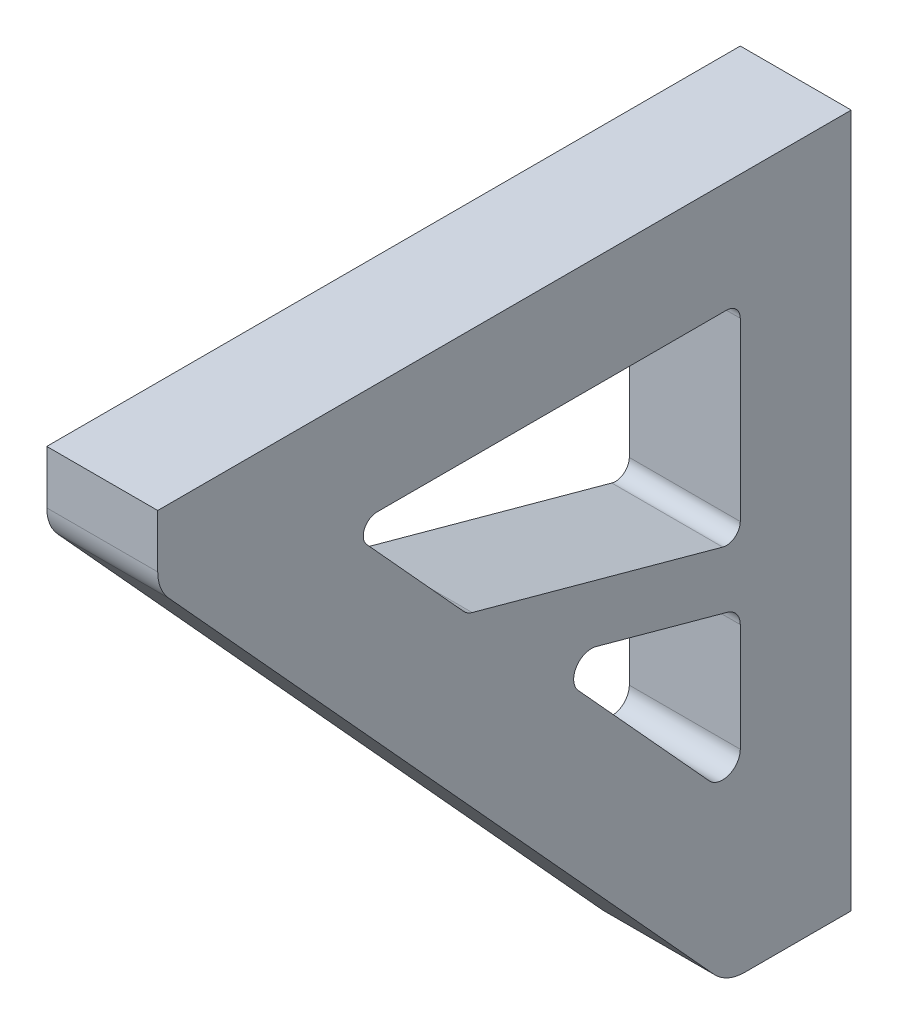
ISO-10303-21;
HEADER;
FILE_DESCRIPTION(('STEP AP214'),'2;1');
FILE_NAME('part.step','',(''),(''),'','','');
FILE_SCHEMA(('AUTOMOTIVE_DESIGN { 1 0 10303 214 1 1 1 1 }'));
ENDSEC;
DATA;
#1=APPLICATION_CONTEXT('core data for automotive mechanical design processes');
#2=APPLICATION_PROTOCOL_DEFINITION('international standard','automotive_design',2000,#1);
#3=PRODUCT_CONTEXT('',#1,'mechanical');
#4=PRODUCT('Part','Part','',(#3));
#5=PRODUCT_RELATED_PRODUCT_CATEGORY('part','',(#4));
#6=PRODUCT_DEFINITION_FORMATION('','',#4);
#7=PRODUCT_DEFINITION_CONTEXT('part definition',#1,'design');
#8=PRODUCT_DEFINITION('design','',#6,#7);
#9=PRODUCT_DEFINITION_SHAPE('','',#8);
#10=(LENGTH_UNIT() NAMED_UNIT(*) SI_UNIT(.MILLI.,.METRE.));
#11=(NAMED_UNIT(*) PLANE_ANGLE_UNIT() SI_UNIT($,.RADIAN.));
#12=(NAMED_UNIT(*) SI_UNIT($,.STERADIAN.) SOLID_ANGLE_UNIT());
#13=UNCERTAINTY_MEASURE_WITH_UNIT(LENGTH_MEASURE(1.E-05),#10,'distance_accuracy_value','');
#14=(GEOMETRIC_REPRESENTATION_CONTEXT(3) GLOBAL_UNCERTAINTY_ASSIGNED_CONTEXT((#13)) GLOBAL_UNIT_ASSIGNED_CONTEXT((#10,
#11,#12)) REPRESENTATION_CONTEXT('',''));
#15=CARTESIAN_POINT('',(0.,0.,0.));
#16=DIRECTION('',(0.,0.,1.));
#17=DIRECTION('',(1.,0.,0.));
#18=AXIS2_PLACEMENT_3D('',#15,#16,#17);
#19=CARTESIAN_POINT('',(8.,0.,50.));
#20=DIRECTION('',(0.,1.,0.));
#21=DIRECTION('',(0.,0.,1.));
#22=AXIS2_PLACEMENT_3D('',#19,#20,#21);
#23=PLANE('',#22);
#24=DIRECTION('',(0.,0.,-1.));
#25=VECTOR('',#24,1.);
#26=CARTESIAN_POINT('',(8.,0.,50.));
#27=LINE('',#26,#25);
#28=CARTESIAN_POINT('',(8.,0.,7.67487166527349));
#29=VERTEX_POINT('',#28);
#30=CARTESIAN_POINT('',(8.,0.,0.));
#31=VERTEX_POINT('',#30);
#32=EDGE_CURVE('E310',#29,#31,#27,.T.);
#33=ORIENTED_EDGE('',*,*,#32,.F.);
#34=DIRECTION('',(-1.,0.,0.));
#35=VECTOR('',#34,1.);
#36=CARTESIAN_POINT('',(8.,0.,7.67487166527349));
#37=LINE('',#36,#35);
#38=CARTESIAN_POINT('',(0.,0.,7.67487166527349));
#39=VERTEX_POINT('',#38);
#40=EDGE_CURVE('E312',#29,#39,#37,.T.);
#41=ORIENTED_EDGE('',*,*,#40,.T.);
#42=DIRECTION('',(0.,0.,-1.));
#43=VECTOR('',#42,1.);
#44=CARTESIAN_POINT('',(0.,0.,50.));
#45=LINE('',#44,#43);
#46=CARTESIAN_POINT('',(0.,0.,0.));
#47=VERTEX_POINT('',#46);
#48=EDGE_CURVE('E294',#39,#47,#45,.T.);
#49=ORIENTED_EDGE('',*,*,#48,.T.);
#50=DIRECTION('',(1.,0.,0.));
#51=VECTOR('',#50,1.);
#52=CARTESIAN_POINT('',(8.,0.,0.));
#53=LINE('',#52,#51);
#54=EDGE_CURVE('E285',#47,#31,#53,.T.);
#55=ORIENTED_EDGE('',*,*,#54,.T.);
#56=EDGE_LOOP('',(#33,#41,#49,#55));
#57=FACE_BOUND('',#56,.T.);
#58=ADVANCED_FACE('F37',(#57),#23,.F.);
#59=CARTESIAN_POINT('',(8.,50.,50.));
#60=DIRECTION('',(-1.,0.,0.));
#61=DIRECTION('',(0.,0.,1.));
#62=AXIS2_PLACEMENT_3D('',#59,#60,#61);
#63=PLANE('',#62);
#64=DIRECTION('',(0.,-1.,0.));
#65=VECTOR('',#64,1.);
#66=CARTESIAN_POINT('',(8.,14.0913484885808,8.));
#67=LINE('',#66,#65);
#68=CARTESIAN_POINT('',(8.,21.8746360039782,8.));
#69=VERTEX_POINT('',#68);
#70=CARTESIAN_POINT('',(8.,14.0913484885808,8.));
#71=VERTEX_POINT('',#70);
#72=EDGE_CURVE('E241',#69,#71,#67,.T.);
#73=ORIENTED_EDGE('',*,*,#72,.T.);
#74=CARTESIAN_POINT('',(8.,14.0913484885807,9.28195910334418));
#75=DIRECTION('',(-1.,0.,0.));
#76=DIRECTION('',(0.,0.,-1.));
#77=AXIS2_PLACEMENT_3D('',#74,#75,#76);
#78=CIRCLE('',#77,1.28195910334418);
#79=CARTESIAN_POINT('',(8.,13.2279618569618,10.2295785770723));
#80=VERTEX_POINT('',#79);
#81=EDGE_CURVE('E256',#71,#80,#78,.T.);
#82=ORIENTED_EDGE('',*,*,#81,.T.);
#83=DIRECTION('',(0.,0.739196337274797,0.673489996183703));
#84=VECTOR('',#83,1.);
#85=CARTESIAN_POINT('',(8.,23.5980334109107,19.6778659928924));
#86=LINE('',#85,#84);
#87=CARTESIAN_POINT('',(8.,23.5980334109107,19.6778659928924));
#88=VERTEX_POINT('',#87);
#89=EDGE_CURVE('E280',#80,#88,#86,.T.);
#90=ORIENTED_EDGE('',*,*,#89,.T.);
#91=CARTESIAN_POINT('',(8.,24.4614200425297,18.7302465191643));
#92=DIRECTION('',(-1.,0.,0.));
#93=DIRECTION('',(0.,0.,1.));
#94=AXIS2_PLACEMENT_3D('',#91,#92,#93);
#95=CIRCLE('',#94,1.28195910334418);
#96=CARTESIAN_POINT('',(8.,25.6978757294878,18.3917255052878));
#97=VERTEX_POINT('',#96);
#98=EDGE_CURVE('E277',#88,#97,#95,.T.);
#99=ORIENTED_EDGE('',*,*,#98,.T.);
#100=DIRECTION('',(0.,-0.264065376963551,-0.96450478313438));
#101=VECTOR('',#100,1.);
#102=CARTESIAN_POINT('',(8.,23.1110916909364,8.94343808946775));
#103=LINE('',#102,#101);
#104=CARTESIAN_POINT('',(8.,23.1110916909364,8.94343808946775));
#105=VERTEX_POINT('',#104);
#106=EDGE_CURVE('E274',#97,#105,#103,.T.);
#107=ORIENTED_EDGE('',*,*,#106,.T.);
#108=CARTESIAN_POINT('',(8.,21.8746360039782,9.28195910334418));
#109=DIRECTION('',(-1.,0.,0.));
#110=DIRECTION('',(0.,0.,1.));
#111=AXIS2_PLACEMENT_3D('',#108,#109,#110);
#112=CIRCLE('',#111,1.28195910334418);
#113=EDGE_CURVE('E271',#105,#69,#112,.T.);
#114=ORIENTED_EDGE('',*,*,#113,.T.);
#115=EDGE_LOOP('',(#73,#82,#90,#99,#107,#114));
#116=FACE_BOUND('',#115,.T.);
#117=DIRECTION('',(0.,-1.,0.));
#118=VECTOR('',#117,1.);
#119=CARTESIAN_POINT('',(8.,28.3105848711872,8.));
#120=LINE('',#119,#118);
#121=CARTESIAN_POINT('',(8.,41.,8.));
#122=VERTEX_POINT('',#121);
#123=CARTESIAN_POINT('',(8.,28.3105848711872,8.));
#124=VERTEX_POINT('',#123);
#125=EDGE_CURVE('E216',#122,#124,#120,.T.);
#126=ORIENTED_EDGE('',*,*,#125,.T.);
#127=CARTESIAN_POINT('',(8.,28.3105848711871,9.));
#128=DIRECTION('',(-1.,0.,0.));
#129=DIRECTION('',(0.,0.,-1.));
#130=AXIS2_PLACEMENT_3D('',#127,#128,#129);
#131=CIRCLE('',#130,1.);
#132=CARTESIAN_POINT('',(8.,27.3460800880528,9.26406537696356));
#133=VERTEX_POINT('',#132);
#134=EDGE_CURVE('E187',#124,#133,#131,.T.);
#135=ORIENTED_EDGE('',*,*,#134,.T.);
#136=DIRECTION('',(0.,0.264065376963552,0.96450478313438));
#137=VECTOR('',#136,1.);
#138=CARTESIAN_POINT('',(8.,32.2922532765692,27.3300752166164));
#139=LINE('',#138,#137);
#140=CARTESIAN_POINT('',(8.,32.2922532765692,27.3300752166164));
#141=VERTEX_POINT('',#140);
#142=EDGE_CURVE('E234',#133,#141,#139,.T.);
#143=ORIENTED_EDGE('',*,*,#142,.T.);
#144=CARTESIAN_POINT('',(8.,33.5287089635274,26.99155420274));
#145=DIRECTION('',(-1.,0.,0.));
#146=DIRECTION('',(0.,0.,-1.));
#147=AXIS2_PLACEMENT_3D('',#144,#145,#146);
#148=CIRCLE('',#147,1.28195910334418);
#149=CARTESIAN_POINT('',(8.,32.6653223319084,27.9391736764681));
#150=VERTEX_POINT('',#149);
#151=EDGE_CURVE('E231',#141,#150,#148,.T.);
#152=ORIENTED_EDGE('',*,*,#151,.T.);
#153=DIRECTION('',(0.,0.739196337274797,0.673489996183703));
#154=VECTOR('',#153,1.);
#155=CARTESIAN_POINT('',(8.,40.3265100038163,34.9193668886508));
#156=LINE('',#155,#154);
#157=CARTESIAN_POINT('',(8.,40.3265100038163,34.9193668886508));
#158=VERTEX_POINT('',#157);
#159=EDGE_CURVE('E228',#150,#158,#156,.T.);
#160=ORIENTED_EDGE('',*,*,#159,.T.);
#161=CARTESIAN_POINT('',(8.,41.,34.180170551376));
#162=DIRECTION('',(-1.,0.,0.));
#163=DIRECTION('',(0.,0.,1.));
#164=AXIS2_PLACEMENT_3D('',#161,#162,#163);
#165=CIRCLE('',#164,1.);
#166=CARTESIAN_POINT('',(8.,42.,34.180170551376));
#167=VERTEX_POINT('',#166);
#168=EDGE_CURVE('E225',#158,#167,#165,.T.);
#169=ORIENTED_EDGE('',*,*,#168,.T.);
#170=DIRECTION('',(0.,0.,-1.));
#171=VECTOR('',#170,1.);
#172=CARTESIAN_POINT('',(8.,42.,9.00000000000001));
#173=LINE('',#172,#171);
#174=CARTESIAN_POINT('',(8.,42.,9.00000000000001));
#175=VERTEX_POINT('',#174);
#176=EDGE_CURVE('E222',#167,#175,#173,.T.);
#177=ORIENTED_EDGE('',*,*,#176,.T.);
#178=CARTESIAN_POINT('',(8.,41.,9.));
#179=DIRECTION('',(-1.,0.,0.));
#180=DIRECTION('',(0.,0.,-1.));
#181=AXIS2_PLACEMENT_3D('',#178,#179,#180);
#182=CIRCLE('',#181,1.);
#183=EDGE_CURVE('E218',#175,#122,#182,.T.);
#184=ORIENTED_EDGE('',*,*,#183,.T.);
#185=EDGE_LOOP('',(#126,#135,#143,#152,#160,#169,#177,#184));
#186=FACE_BOUND('',#185,.T.);
#187=DIRECTION('',(0.,-0.739196337274797,-0.673489996183704));
#188=VECTOR('',#187,1.);
#189=CARTESIAN_POINT('',(8.,0.,9.));
#190=LINE('',#189,#188);
#191=CARTESIAN_POINT('',(8.,44.1412562324902,49.2175890118244));
#192=VERTEX_POINT('',#191);
#193=CARTESIAN_POINT('',(8.,0.979530011448891,9.89246067709788));
#194=VERTEX_POINT('',#193);
#195=EDGE_CURVE('E210',#192,#194,#190,.T.);
#196=ORIENTED_EDGE('',*,*,#195,.T.);
#197=CARTESIAN_POINT('',(8.,3.,7.67487166527349));
#198=DIRECTION('',(-1.,0.,0.));
#199=DIRECTION('',(0.,0.,1.));
#200=AXIS2_PLACEMENT_3D('',#197,#198,#199);
#201=CIRCLE('',#200,3.);
#202=EDGE_CURVE('E45',#194,#29,#201,.F.);
#203=ORIENTED_EDGE('',*,*,#202,.T.);
#204=ORIENTED_EDGE('',*,*,#32,.T.);
#205=DIRECTION('',(0.,1.,0.));
#206=VECTOR('',#205,1.);
#207=CARTESIAN_POINT('',(8.,50.,0.));
#208=LINE('',#207,#206);
#209=CARTESIAN_POINT('',(8.,50.,0.));
#210=VERTEX_POINT('',#209);
#211=EDGE_CURVE('E297',#31,#210,#208,.T.);
#212=ORIENTED_EDGE('',*,*,#211,.T.);
#213=DIRECTION('',(0.,0.,-1.));
#214=VECTOR('',#213,1.);
#215=CARTESIAN_POINT('',(8.,50.,50.));
#216=LINE('',#215,#214);
#217=CARTESIAN_POINT('',(8.,50.,50.));
#218=VERTEX_POINT('',#217);
#219=EDGE_CURVE('E307',#218,#210,#216,.T.);
#220=ORIENTED_EDGE('',*,*,#219,.F.);
#221=DIRECTION('',(0.,1.,0.));
#222=VECTOR('',#221,1.);
#223=CARTESIAN_POINT('',(8.,50.,50.));
#224=LINE('',#223,#222);
#225=CARTESIAN_POINT('',(8.,46.1617262210413,50.));
#226=VERTEX_POINT('',#225);
#227=EDGE_CURVE('E287',#226,#218,#224,.T.);
#228=ORIENTED_EDGE('',*,*,#227,.F.);
#229=CARTESIAN_POINT('',(8.,46.1617262210413,47.));
#230=DIRECTION('',(-1.,0.,0.));
#231=DIRECTION('',(0.,0.,1.));
#232=AXIS2_PLACEMENT_3D('',#229,#230,#231);
#233=CIRCLE('',#232,3.);
#234=EDGE_CURVE('E323',#226,#192,#233,.F.);
#235=ORIENTED_EDGE('',*,*,#234,.T.);
#236=EDGE_LOOP('',(#196,#203,#204,#212,#220,#228,#235));
#237=FACE_BOUND('',#236,.T.);
#238=ADVANCED_FACE('F327',(#116,#186,#237),#63,.F.);
#239=CARTESIAN_POINT('',(0.,50.,50.));
#240=DIRECTION('',(0.,-1.,0.));
#241=DIRECTION('',(0.,0.,-1.));
#242=AXIS2_PLACEMENT_3D('',#239,#240,#241);
#243=PLANE('',#242);
#244=DIRECTION('',(-1.,0.,0.));
#245=VECTOR('',#244,1.);
#246=CARTESIAN_POINT('',(0.,50.,0.));
#247=LINE('',#246,#245);
#248=CARTESIAN_POINT('',(0.,50.,0.));
#249=VERTEX_POINT('',#248);
#250=EDGE_CURVE('E299',#210,#249,#247,.T.);
#251=ORIENTED_EDGE('',*,*,#250,.T.);
#252=DIRECTION('',(0.,0.,-1.));
#253=VECTOR('',#252,1.);
#254=CARTESIAN_POINT('',(0.,50.,50.));
#255=LINE('',#254,#253);
#256=CARTESIAN_POINT('',(0.,50.,50.));
#257=VERTEX_POINT('',#256);
#258=EDGE_CURVE('E304',#257,#249,#255,.T.);
#259=ORIENTED_EDGE('',*,*,#258,.F.);
#260=DIRECTION('',(-1.,0.,0.));
#261=VECTOR('',#260,1.);
#262=CARTESIAN_POINT('',(0.,50.,50.));
#263=LINE('',#262,#261);
#264=EDGE_CURVE('E289',#218,#257,#263,.T.);
#265=ORIENTED_EDGE('',*,*,#264,.F.);
#266=ORIENTED_EDGE('',*,*,#219,.T.);
#267=EDGE_LOOP('',(#251,#259,#265,#266));
#268=FACE_BOUND('',#267,.T.);
#269=ADVANCED_FACE('F346',(#268),#243,.F.);
#270=CARTESIAN_POINT('',(0.,0.,50.));
#271=DIRECTION('',(1.,0.,0.));
#272=DIRECTION('',(0.,0.,-1.));
#273=AXIS2_PLACEMENT_3D('',#270,#271,#272);
#274=PLANE('',#273);
#275=DIRECTION('',(0.,0.739196337274797,0.673489996183703));
#276=VECTOR('',#275,1.);
#277=CARTESIAN_POINT('',(0.,23.5980334109107,19.6778659928924));
#278=LINE('',#277,#276);
#279=CARTESIAN_POINT('',(0.,13.2279618569618,10.2295785770723));
#280=VERTEX_POINT('',#279);
#281=CARTESIAN_POINT('',(0.,23.5980334109107,19.6778659928924));
#282=VERTEX_POINT('',#281);
#283=EDGE_CURVE('E265',#280,#282,#278,.T.);
#284=ORIENTED_EDGE('',*,*,#283,.F.);
#285=CARTESIAN_POINT('',(0.,14.0913484885807,9.28195910334418));
#286=DIRECTION('',(-1.,0.,0.));
#287=DIRECTION('',(0.,0.,-1.));
#288=AXIS2_PLACEMENT_3D('',#285,#286,#287);
#289=CIRCLE('',#288,1.28195910334418);
#290=CARTESIAN_POINT('',(0.,14.0913484885808,8.));
#291=VERTEX_POINT('',#290);
#292=EDGE_CURVE('E192',#291,#280,#289,.T.);
#293=ORIENTED_EDGE('',*,*,#292,.F.);
#294=DIRECTION('',(0.,-1.,0.));
#295=VECTOR('',#294,1.);
#296=CARTESIAN_POINT('',(0.,14.0913484885808,8.));
#297=LINE('',#296,#295);
#298=CARTESIAN_POINT('',(0.,21.8746360039782,8.));
#299=VERTEX_POINT('',#298);
#300=EDGE_CURVE('E252',#299,#291,#297,.T.);
#301=ORIENTED_EDGE('',*,*,#300,.F.);
#302=CARTESIAN_POINT('',(0.,21.8746360039782,9.28195910334418));
#303=DIRECTION('',(-1.,0.,0.));
#304=DIRECTION('',(0.,0.,1.));
#305=AXIS2_PLACEMENT_3D('',#302,#303,#304);
#306=CIRCLE('',#305,1.28195910334418);
#307=CARTESIAN_POINT('',(0.,23.1110916909364,8.94343808946775));
#308=VERTEX_POINT('',#307);
#309=EDGE_CURVE('E255',#308,#299,#306,.T.);
#310=ORIENTED_EDGE('',*,*,#309,.F.);
#311=DIRECTION('',(0.,-0.264065376963551,-0.96450478313438));
#312=VECTOR('',#311,1.);
#313=CARTESIAN_POINT('',(0.,23.1110916909364,8.94343808946775));
#314=LINE('',#313,#312);
#315=CARTESIAN_POINT('',(0.,25.6978757294878,18.3917255052878));
#316=VERTEX_POINT('',#315);
#317=EDGE_CURVE('E259',#316,#308,#314,.T.);
#318=ORIENTED_EDGE('',*,*,#317,.F.);
#319=CARTESIAN_POINT('',(0.,24.4614200425297,18.7302465191643));
#320=DIRECTION('',(-1.,0.,0.));
#321=DIRECTION('',(0.,0.,1.));
#322=AXIS2_PLACEMENT_3D('',#319,#320,#321);
#323=CIRCLE('',#322,1.28195910334418);
#324=EDGE_CURVE('E262',#282,#316,#323,.T.);
#325=ORIENTED_EDGE('',*,*,#324,.F.);
#326=EDGE_LOOP('',(#284,#293,#301,#310,#318,#325));
#327=FACE_BOUND('',#326,.T.);
#328=DIRECTION('',(0.,0.264065376963552,0.96450478313438));
#329=VECTOR('',#328,1.);
#330=CARTESIAN_POINT('',(0.,32.2922532765692,27.3300752166164));
#331=LINE('',#330,#329);
#332=CARTESIAN_POINT('',(0.,27.3460800880528,9.26406537696356));
#333=VERTEX_POINT('',#332);
#334=CARTESIAN_POINT('',(0.,32.2922532765692,27.3300752166164));
#335=VERTEX_POINT('',#334);
#336=EDGE_CURVE('E207',#333,#335,#331,.T.);
#337=ORIENTED_EDGE('',*,*,#336,.F.);
#338=CARTESIAN_POINT('',(0.,28.3105848711871,9.));
#339=DIRECTION('',(-1.,0.,0.));
#340=DIRECTION('',(0.,0.,-1.));
#341=AXIS2_PLACEMENT_3D('',#338,#339,#340);
#342=CIRCLE('',#341,1.);
#343=CARTESIAN_POINT('',(0.,28.3105848711872,8.));
#344=VERTEX_POINT('',#343);
#345=EDGE_CURVE('E184',#344,#333,#342,.T.);
#346=ORIENTED_EDGE('',*,*,#345,.F.);
#347=DIRECTION('',(0.,-1.,0.));
#348=VECTOR('',#347,1.);
#349=CARTESIAN_POINT('',(0.,28.3105848711872,8.));
#350=LINE('',#349,#348);
#351=CARTESIAN_POINT('',(0.,41.,8.));
#352=VERTEX_POINT('',#351);
#353=EDGE_CURVE('E195',#352,#344,#350,.T.);
#354=ORIENTED_EDGE('',*,*,#353,.F.);
#355=CARTESIAN_POINT('',(0.,41.,9.));
#356=DIRECTION('',(-1.,0.,0.));
#357=DIRECTION('',(0.,0.,-1.));
#358=AXIS2_PLACEMENT_3D('',#355,#356,#357);
#359=CIRCLE('',#358,1.);
#360=CARTESIAN_POINT('',(0.,42.,9.00000000000001));
#361=VERTEX_POINT('',#360);
#362=EDGE_CURVE('E200',#361,#352,#359,.T.);
#363=ORIENTED_EDGE('',*,*,#362,.F.);
#364=DIRECTION('',(0.,0.,-1.));
#365=VECTOR('',#364,1.);
#366=CARTESIAN_POINT('',(0.,42.,9.00000000000001));
#367=LINE('',#366,#365);
#368=CARTESIAN_POINT('',(0.,42.,34.180170551376));
#369=VERTEX_POINT('',#368);
#370=EDGE_CURVE('E428',#369,#361,#367,.T.);
#371=ORIENTED_EDGE('',*,*,#370,.F.);
#372=CARTESIAN_POINT('',(0.,41.,34.180170551376));
#373=DIRECTION('',(-1.,0.,0.));
#374=DIRECTION('',(0.,0.,1.));
#375=AXIS2_PLACEMENT_3D('',#372,#373,#374);
#376=CIRCLE('',#375,1.);
#377=CARTESIAN_POINT('',(0.,40.3265100038163,34.9193668886508));
#378=VERTEX_POINT('',#377);
#379=EDGE_CURVE('E430',#378,#369,#376,.T.);
#380=ORIENTED_EDGE('',*,*,#379,.F.);
#381=DIRECTION('',(0.,0.739196337274797,0.673489996183703));
#382=VECTOR('',#381,1.);
#383=CARTESIAN_POINT('',(0.,40.3265100038163,34.9193668886508));
#384=LINE('',#383,#382);
#385=CARTESIAN_POINT('',(0.,32.6653223319084,27.9391736764681));
#386=VERTEX_POINT('',#385);
#387=EDGE_CURVE('E433',#386,#378,#384,.T.);
#388=ORIENTED_EDGE('',*,*,#387,.F.);
#389=CARTESIAN_POINT('',(0.,33.5287089635274,26.99155420274));
#390=DIRECTION('',(-1.,0.,0.));
#391=DIRECTION('',(0.,0.,-1.));
#392=AXIS2_PLACEMENT_3D('',#389,#390,#391);
#393=CIRCLE('',#392,1.28195910334418);
#394=EDGE_CURVE('E212',#335,#386,#393,.T.);
#395=ORIENTED_EDGE('',*,*,#394,.F.);
#396=EDGE_LOOP('',(#337,#346,#354,#363,#371,#380,#388,#395));
#397=FACE_BOUND('',#396,.T.);
#398=ORIENTED_EDGE('',*,*,#48,.F.);
#399=CARTESIAN_POINT('',(0.,3.,7.67487166527349));
#400=DIRECTION('',(1.,0.,0.));
#401=DIRECTION('',(0.,0.,-1.));
#402=AXIS2_PLACEMENT_3D('',#399,#400,#401);
#403=CIRCLE('',#402,3.);
#404=CARTESIAN_POINT('',(0.,0.979530011448891,9.89246067709788));
#405=VERTEX_POINT('',#404);
#406=EDGE_CURVE('E317',#39,#405,#403,.F.);
#407=ORIENTED_EDGE('',*,*,#406,.T.);
#408=DIRECTION('',(0.,-0.739196337274797,-0.673489996183704));
#409=VECTOR('',#408,1.);
#410=CARTESIAN_POINT('',(0.,0.,9.));
#411=LINE('',#410,#409);
#412=CARTESIAN_POINT('',(0.,44.1412562324902,49.2175890118244));
#413=VERTEX_POINT('',#412);
#414=EDGE_CURVE('E208',#413,#405,#411,.T.);
#415=ORIENTED_EDGE('',*,*,#414,.F.);
#416=CARTESIAN_POINT('',(0.,46.1617262210413,47.));
#417=DIRECTION('',(1.,0.,0.));
#418=DIRECTION('',(0.,0.,-1.));
#419=AXIS2_PLACEMENT_3D('',#416,#417,#418);
#420=CIRCLE('',#419,3.);
#421=CARTESIAN_POINT('',(0.,46.1617262210413,50.));
#422=VERTEX_POINT('',#421);
#423=EDGE_CURVE('E315',#413,#422,#420,.F.);
#424=ORIENTED_EDGE('',*,*,#423,.T.);
#425=DIRECTION('',(0.,-1.,0.));
#426=VECTOR('',#425,1.);
#427=CARTESIAN_POINT('',(0.,0.,50.));
#428=LINE('',#427,#426);
#429=EDGE_CURVE('E292',#257,#422,#428,.T.);
#430=ORIENTED_EDGE('',*,*,#429,.F.);
#431=ORIENTED_EDGE('',*,*,#258,.T.);
#432=DIRECTION('',(0.,-1.,0.));
#433=VECTOR('',#432,1.);
#434=CARTESIAN_POINT('',(0.,0.,0.));
#435=LINE('',#434,#433);
#436=EDGE_CURVE('E290',#249,#47,#435,.T.);
#437=ORIENTED_EDGE('',*,*,#436,.T.);
#438=EDGE_LOOP('',(#398,#407,#415,#424,#430,#431,#437));
#439=FACE_BOUND('',#438,.T.);
#440=ADVANCED_FACE('F203',(#327,#397,#439),#274,.F.);
#441=CARTESIAN_POINT('',(0.,0.,50.));
#442=DIRECTION('',(0.,0.,-1.));
#443=DIRECTION('',(-1.,0.,0.));
#444=AXIS2_PLACEMENT_3D('',#441,#442,#443);
#445=PLANE('',#444);
#446=ORIENTED_EDGE('',*,*,#429,.T.);
#447=DIRECTION('',(-1.,0.,0.));
#448=VECTOR('',#447,1.);
#449=CARTESIAN_POINT('',(0.,46.1617262210413,50.));
#450=LINE('',#449,#448);
#451=EDGE_CURVE('E11',#422,#226,#450,.F.);
#452=ORIENTED_EDGE('',*,*,#451,.T.);
#453=ORIENTED_EDGE('',*,*,#227,.T.);
#454=ORIENTED_EDGE('',*,*,#264,.T.);
#455=EDGE_LOOP('',(#446,#452,#453,#454));
#456=FACE_BOUND('',#455,.T.);
#457=ADVANCED_FACE('F341',(#456),#445,.F.);
#458=CARTESIAN_POINT('',(0.,0.,0.));
#459=DIRECTION('',(0.,0.,-1.));
#460=DIRECTION('',(-1.,0.,0.));
#461=AXIS2_PLACEMENT_3D('',#458,#459,#460);
#462=PLANE('',#461);
#463=ORIENTED_EDGE('',*,*,#54,.F.);
#464=ORIENTED_EDGE('',*,*,#436,.F.);
#465=ORIENTED_EDGE('',*,*,#250,.F.);
#466=ORIENTED_EDGE('',*,*,#211,.F.);
#467=EDGE_LOOP('',(#463,#464,#465,#466));
#468=FACE_BOUND('',#467,.T.);
#469=ADVANCED_FACE('F350',(#468),#462,.T.);
#470=CARTESIAN_POINT('',(8.,0.,9.));
#471=DIRECTION('',(0.,0.673489996183704,-0.739196337274797));
#472=DIRECTION('',(0.,0.739196337274797,0.673489996183704));
#473=AXIS2_PLACEMENT_3D('',#470,#471,#472);
#474=PLANE('',#473);
#475=ORIENTED_EDGE('',*,*,#414,.T.);
#476=DIRECTION('',(-1.,0.,0.));
#477=VECTOR('',#476,1.);
#478=CARTESIAN_POINT('',(8.,0.979530011448891,9.89246067709788));
#479=LINE('',#478,#477);
#480=EDGE_CURVE('E58',#405,#194,#479,.F.);
#481=ORIENTED_EDGE('',*,*,#480,.T.);
#482=ORIENTED_EDGE('',*,*,#195,.F.);
#483=DIRECTION('',(-1.,0.,0.));
#484=VECTOR('',#483,1.);
#485=CARTESIAN_POINT('',(8.,44.1412562324902,49.2175890118244));
#486=LINE('',#485,#484);
#487=EDGE_CURVE('E319',#192,#413,#486,.T.);
#488=ORIENTED_EDGE('',*,*,#487,.T.);
#489=EDGE_LOOP('',(#475,#481,#482,#488));
#490=FACE_BOUND('',#489,.T.);
#491=ADVANCED_FACE('F336',(#490),#474,.F.);
#492=CARTESIAN_POINT('',(8.,28.3105848711871,9.));
#493=DIRECTION('',(-1.,0.,0.));
#494=DIRECTION('',(0.,0.,1.));
#495=AXIS2_PLACEMENT_3D('',#492,#493,#494);
#496=CYLINDRICAL_SURFACE('',#495,1.);
#497=ORIENTED_EDGE('',*,*,#345,.T.);
#498=DIRECTION('',(-1.,0.,0.));
#499=VECTOR('',#498,1.);
#500=CARTESIAN_POINT('',(8.,27.3460800880528,9.26406537696356));
#501=LINE('',#500,#499);
#502=EDGE_CURVE('E219',#133,#333,#501,.T.);
#503=ORIENTED_EDGE('',*,*,#502,.F.);
#504=ORIENTED_EDGE('',*,*,#134,.F.);
#505=DIRECTION('',(-1.,0.,0.));
#506=VECTOR('',#505,1.);
#507=CARTESIAN_POINT('',(8.,28.3105848711872,8.));
#508=LINE('',#507,#506);
#509=EDGE_CURVE('E180',#124,#344,#508,.T.);
#510=ORIENTED_EDGE('',*,*,#509,.T.);
#511=EDGE_LOOP('',(#497,#503,#504,#510));
#512=FACE_BOUND('',#511,.T.);
#513=ADVANCED_FACE('F182',(#512),#496,.F.);
#514=CARTESIAN_POINT('',(8.,28.3105848711872,8.));
#515=DIRECTION('',(0.,0.,-1.));
#516=DIRECTION('',(-1.,0.,0.));
#517=AXIS2_PLACEMENT_3D('',#514,#515,#516);
#518=PLANE('',#517);
#519=ORIENTED_EDGE('',*,*,#353,.T.);
#520=ORIENTED_EDGE('',*,*,#509,.F.);
#521=ORIENTED_EDGE('',*,*,#125,.F.);
#522=DIRECTION('',(-1.,0.,0.));
#523=VECTOR('',#522,1.);
#524=CARTESIAN_POINT('',(8.,41.,8.));
#525=LINE('',#524,#523);
#526=EDGE_CURVE('E191',#122,#352,#525,.T.);
#527=ORIENTED_EDGE('',*,*,#526,.T.);
#528=EDGE_LOOP('',(#519,#520,#521,#527));
#529=FACE_BOUND('',#528,.T.);
#530=ADVANCED_FACE('F196',(#529),#518,.F.);
#531=CARTESIAN_POINT('',(8.,41.,9.));
#532=DIRECTION('',(-1.,0.,0.));
#533=DIRECTION('',(0.,0.,1.));
#534=AXIS2_PLACEMENT_3D('',#531,#532,#533);
#535=CYLINDRICAL_SURFACE('',#534,1.);
#536=ORIENTED_EDGE('',*,*,#362,.T.);
#537=ORIENTED_EDGE('',*,*,#526,.F.);
#538=ORIENTED_EDGE('',*,*,#183,.F.);
#539=DIRECTION('',(-1.,0.,0.));
#540=VECTOR('',#539,1.);
#541=CARTESIAN_POINT('',(8.,42.,9.00000000000001));
#542=LINE('',#541,#540);
#543=EDGE_CURVE('E420',#175,#361,#542,.T.);
#544=ORIENTED_EDGE('',*,*,#543,.T.);
#545=EDGE_LOOP('',(#536,#537,#538,#544));
#546=FACE_BOUND('',#545,.T.);
#547=ADVANCED_FACE('F419',(#546),#535,.F.);
#548=CARTESIAN_POINT('',(8.,42.,9.00000000000001));
#549=DIRECTION('',(0.,1.,0.));
#550=DIRECTION('',(0.,0.,1.));
#551=AXIS2_PLACEMENT_3D('',#548,#549,#550);
#552=PLANE('',#551);
#553=ORIENTED_EDGE('',*,*,#370,.T.);
#554=ORIENTED_EDGE('',*,*,#543,.F.);
#555=ORIENTED_EDGE('',*,*,#176,.F.);
#556=DIRECTION('',(-1.,0.,0.));
#557=VECTOR('',#556,1.);
#558=CARTESIAN_POINT('',(8.,42.,34.180170551376));
#559=LINE('',#558,#557);
#560=EDGE_CURVE('E423',#167,#369,#559,.T.);
#561=ORIENTED_EDGE('',*,*,#560,.T.);
#562=EDGE_LOOP('',(#553,#554,#555,#561));
#563=FACE_BOUND('',#562,.T.);
#564=ADVANCED_FACE('F454',(#563),#552,.F.);
#565=CARTESIAN_POINT('',(8.,41.,34.180170551376));
#566=DIRECTION('',(-1.,0.,0.));
#567=DIRECTION('',(0.,0.,1.));
#568=AXIS2_PLACEMENT_3D('',#565,#566,#567);
#569=CYLINDRICAL_SURFACE('',#568,1.);
#570=ORIENTED_EDGE('',*,*,#379,.T.);
#571=ORIENTED_EDGE('',*,*,#560,.F.);
#572=ORIENTED_EDGE('',*,*,#168,.F.);
#573=DIRECTION('',(-1.,0.,0.));
#574=VECTOR('',#573,1.);
#575=CARTESIAN_POINT('',(8.,40.3265100038163,34.9193668886508));
#576=LINE('',#575,#574);
#577=EDGE_CURVE('E447',#158,#378,#576,.T.);
#578=ORIENTED_EDGE('',*,*,#577,.T.);
#579=EDGE_LOOP('',(#570,#571,#572,#578));
#580=FACE_BOUND('',#579,.T.);
#581=ADVANCED_FACE('F456',(#580),#569,.F.);
#582=CARTESIAN_POINT('',(8.,40.3265100038163,34.9193668886508));
#583=DIRECTION('',(0.,-0.673489996183703,0.739196337274797));
#584=DIRECTION('',(0.,-0.739196337274797,-0.673489996183703));
#585=AXIS2_PLACEMENT_3D('',#582,#583,#584);
#586=PLANE('',#585);
#587=ORIENTED_EDGE('',*,*,#387,.T.);
#588=ORIENTED_EDGE('',*,*,#577,.F.);
#589=ORIENTED_EDGE('',*,*,#159,.F.);
#590=DIRECTION('',(-1.,0.,0.));
#591=VECTOR('',#590,1.);
#592=CARTESIAN_POINT('',(8.,32.6653223319084,27.9391736764681));
#593=LINE('',#592,#591);
#594=EDGE_CURVE('E439',#150,#386,#593,.T.);
#595=ORIENTED_EDGE('',*,*,#594,.T.);
#596=EDGE_LOOP('',(#587,#588,#589,#595));
#597=FACE_BOUND('',#596,.T.);
#598=ADVANCED_FACE('F446',(#597),#586,.F.);
#599=CARTESIAN_POINT('',(8.,33.5287089635274,26.99155420274));
#600=DIRECTION('',(-1.,0.,0.));
#601=DIRECTION('',(0.,0.,1.));
#602=AXIS2_PLACEMENT_3D('',#599,#600,#601);
#603=CYLINDRICAL_SURFACE('',#602,1.28195910334418);
#604=ORIENTED_EDGE('',*,*,#394,.T.);
#605=ORIENTED_EDGE('',*,*,#594,.F.);
#606=ORIENTED_EDGE('',*,*,#151,.F.);
#607=DIRECTION('',(-1.,0.,0.));
#608=VECTOR('',#607,1.);
#609=CARTESIAN_POINT('',(8.,32.2922532765692,27.3300752166164));
#610=LINE('',#609,#608);
#611=EDGE_CURVE('E442',#141,#335,#610,.T.);
#612=ORIENTED_EDGE('',*,*,#611,.T.);
#613=EDGE_LOOP('',(#604,#605,#606,#612));
#614=FACE_BOUND('',#613,.T.);
#615=ADVANCED_FACE('F438',(#614),#603,.F.);
#616=CARTESIAN_POINT('',(8.,32.2922532765692,27.3300752166164));
#617=DIRECTION('',(0.,-0.96450478313438,0.264065376963552));
#618=DIRECTION('',(0.,-0.264065376963552,-0.96450478313438));
#619=AXIS2_PLACEMENT_3D('',#616,#617,#618);
#620=PLANE('',#619);
#621=ORIENTED_EDGE('',*,*,#336,.T.);
#622=ORIENTED_EDGE('',*,*,#611,.F.);
#623=ORIENTED_EDGE('',*,*,#142,.F.);
#624=ORIENTED_EDGE('',*,*,#502,.T.);
#625=EDGE_LOOP('',(#621,#622,#623,#624));
#626=FACE_BOUND('',#625,.T.);
#627=ADVANCED_FACE('F400',(#626),#620,.F.);
#628=CARTESIAN_POINT('',(8.,14.0913484885807,9.28195910334418));
#629=DIRECTION('',(-1.,0.,0.));
#630=DIRECTION('',(0.,0.,1.));
#631=AXIS2_PLACEMENT_3D('',#628,#629,#630);
#632=CYLINDRICAL_SURFACE('',#631,1.28195910334418);
#633=ORIENTED_EDGE('',*,*,#292,.T.);
#634=DIRECTION('',(-1.,0.,0.));
#635=VECTOR('',#634,1.);
#636=CARTESIAN_POINT('',(8.,13.2279618569618,10.2295785770723));
#637=LINE('',#636,#635);
#638=EDGE_CURVE('E238',#80,#280,#637,.T.);
#639=ORIENTED_EDGE('',*,*,#638,.F.);
#640=ORIENTED_EDGE('',*,*,#81,.F.);
#641=DIRECTION('',(-1.,0.,0.));
#642=VECTOR('',#641,1.);
#643=CARTESIAN_POINT('',(8.,14.0913484885808,8.));
#644=LINE('',#643,#642);
#645=EDGE_CURVE('E250',#71,#291,#644,.T.);
#646=ORIENTED_EDGE('',*,*,#645,.T.);
#647=EDGE_LOOP('',(#633,#639,#640,#646));
#648=FACE_BOUND('',#647,.T.);
#649=ADVANCED_FACE('F384',(#648),#632,.F.);
#650=CARTESIAN_POINT('',(8.,14.0913484885808,8.));
#651=DIRECTION('',(0.,0.,-1.));
#652=DIRECTION('',(-1.,0.,0.));
#653=AXIS2_PLACEMENT_3D('',#650,#651,#652);
#654=PLANE('',#653);
#655=ORIENTED_EDGE('',*,*,#300,.T.);
#656=ORIENTED_EDGE('',*,*,#645,.F.);
#657=ORIENTED_EDGE('',*,*,#72,.F.);
#658=DIRECTION('',(-1.,0.,0.));
#659=VECTOR('',#658,1.);
#660=CARTESIAN_POINT('',(8.,21.8746360039782,8.));
#661=LINE('',#660,#659);
#662=EDGE_CURVE('E248',#69,#299,#661,.T.);
#663=ORIENTED_EDGE('',*,*,#662,.T.);
#664=EDGE_LOOP('',(#655,#656,#657,#663));
#665=FACE_BOUND('',#664,.T.);
#666=ADVANCED_FACE('F393',(#665),#654,.F.);
#667=CARTESIAN_POINT('',(8.,21.8746360039782,9.28195910334418));
#668=DIRECTION('',(-1.,0.,0.));
#669=DIRECTION('',(0.,0.,1.));
#670=AXIS2_PLACEMENT_3D('',#667,#668,#669);
#671=CYLINDRICAL_SURFACE('',#670,1.28195910334418);
#672=ORIENTED_EDGE('',*,*,#309,.T.);
#673=ORIENTED_EDGE('',*,*,#662,.F.);
#674=ORIENTED_EDGE('',*,*,#113,.F.);
#675=DIRECTION('',(-1.,0.,0.));
#676=VECTOR('',#675,1.);
#677=CARTESIAN_POINT('',(8.,23.1110916909364,8.94343808946775));
#678=LINE('',#677,#676);
#679=EDGE_CURVE('E246',#105,#308,#678,.T.);
#680=ORIENTED_EDGE('',*,*,#679,.T.);
#681=EDGE_LOOP('',(#672,#673,#674,#680));
#682=FACE_BOUND('',#681,.T.);
#683=ADVANCED_FACE('F389',(#682),#671,.F.);
#684=CARTESIAN_POINT('',(8.,23.1110916909364,8.94343808946775));
#685=DIRECTION('',(0.,0.96450478313438,-0.264065376963551));
#686=DIRECTION('',(0.,0.264065376963551,0.96450478313438));
#687=AXIS2_PLACEMENT_3D('',#684,#685,#686);
#688=PLANE('',#687);
#689=ORIENTED_EDGE('',*,*,#317,.T.);
#690=ORIENTED_EDGE('',*,*,#679,.F.);
#691=ORIENTED_EDGE('',*,*,#106,.F.);
#692=DIRECTION('',(-1.,0.,0.));
#693=VECTOR('',#692,1.);
#694=CARTESIAN_POINT('',(8.,25.6978757294878,18.3917255052878));
#695=LINE('',#694,#693);
#696=EDGE_CURVE('E244',#97,#316,#695,.T.);
#697=ORIENTED_EDGE('',*,*,#696,.T.);
#698=EDGE_LOOP('',(#689,#690,#691,#697));
#699=FACE_BOUND('',#698,.T.);
#700=ADVANCED_FACE('F380',(#699),#688,.F.);
#701=CARTESIAN_POINT('',(8.,24.4614200425297,18.7302465191643));
#702=DIRECTION('',(-1.,0.,0.));
#703=DIRECTION('',(0.,0.,1.));
#704=AXIS2_PLACEMENT_3D('',#701,#702,#703);
#705=CYLINDRICAL_SURFACE('',#704,1.28195910334418);
#706=ORIENTED_EDGE('',*,*,#324,.T.);
#707=ORIENTED_EDGE('',*,*,#696,.F.);
#708=ORIENTED_EDGE('',*,*,#98,.F.);
#709=DIRECTION('',(-1.,0.,0.));
#710=VECTOR('',#709,1.);
#711=CARTESIAN_POINT('',(8.,23.5980334109107,19.6778659928924));
#712=LINE('',#711,#710);
#713=EDGE_CURVE('E242',#88,#282,#712,.T.);
#714=ORIENTED_EDGE('',*,*,#713,.T.);
#715=EDGE_LOOP('',(#706,#707,#708,#714));
#716=FACE_BOUND('',#715,.T.);
#717=ADVANCED_FACE('F374',(#716),#705,.F.);
#718=CARTESIAN_POINT('',(8.,23.5980334109107,19.6778659928924));
#719=DIRECTION('',(0.,-0.673489996183703,0.739196337274797));
#720=DIRECTION('',(0.,-0.739196337274797,-0.673489996183703));
#721=AXIS2_PLACEMENT_3D('',#718,#719,#720);
#722=PLANE('',#721);
#723=ORIENTED_EDGE('',*,*,#283,.T.);
#724=ORIENTED_EDGE('',*,*,#713,.F.);
#725=ORIENTED_EDGE('',*,*,#89,.F.);
#726=ORIENTED_EDGE('',*,*,#638,.T.);
#727=EDGE_LOOP('',(#723,#724,#725,#726));
#728=FACE_BOUND('',#727,.T.);
#729=ADVANCED_FACE('F369',(#728),#722,.F.);
#730=CARTESIAN_POINT('',(8.,3.,7.67487166527349));
#731=DIRECTION('',(-1.,0.,0.));
#732=DIRECTION('',(0.,0.,1.));
#733=AXIS2_PLACEMENT_3D('',#730,#731,#732);
#734=CYLINDRICAL_SURFACE('',#733,3.);
#735=ORIENTED_EDGE('',*,*,#202,.F.);
#736=ORIENTED_EDGE('',*,*,#480,.F.);
#737=ORIENTED_EDGE('',*,*,#406,.F.);
#738=ORIENTED_EDGE('',*,*,#40,.F.);
#739=EDGE_LOOP('',(#735,#736,#737,#738));
#740=FACE_BOUND('',#739,.T.);
#741=ADVANCED_FACE('F334',(#740),#734,.T.);
#742=CARTESIAN_POINT('',(8.,46.1617262210413,47.));
#743=DIRECTION('',(-1.,0.,0.));
#744=DIRECTION('',(0.,0.,1.));
#745=AXIS2_PLACEMENT_3D('',#742,#743,#744);
#746=CYLINDRICAL_SURFACE('',#745,3.);
#747=ORIENTED_EDGE('',*,*,#234,.F.);
#748=ORIENTED_EDGE('',*,*,#451,.F.);
#749=ORIENTED_EDGE('',*,*,#423,.F.);
#750=ORIENTED_EDGE('',*,*,#487,.F.);
#751=EDGE_LOOP('',(#747,#748,#749,#750));
#752=FACE_BOUND('',#751,.T.);
#753=ADVANCED_FACE('F39',(#752),#746,.T.);
#754=CLOSED_SHELL('',(#58,#238,#269,#440,#457,#469,#491,#513,#530,#547,#564,#581,#598,#615,#627,
#649,#666,#683,#700,#717,#729,#741,#753));
#755=MANIFOLD_SOLID_BREP('B2',#754);
#756=ADVANCED_BREP_SHAPE_REPRESENTATION('',(#18,#755),#14);
#757=SHAPE_DEFINITION_REPRESENTATION(#9,#756);
ENDSEC;
END-ISO-10303-21;
